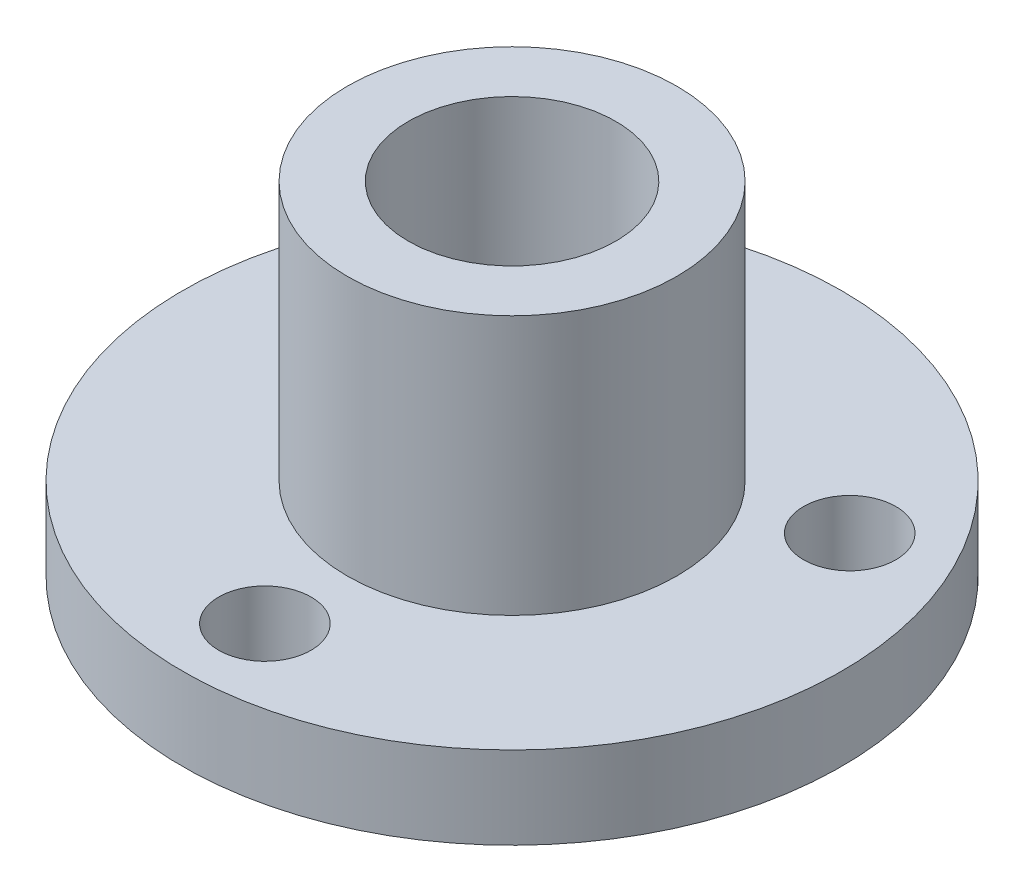
ISO-10303-21;
HEADER;
FILE_DESCRIPTION(('STEP AP214'),'2;1');
FILE_NAME('part.step','',(''),(''),'','','');
FILE_SCHEMA(('AUTOMOTIVE_DESIGN { 1 0 10303 214 1 1 1 1 }'));
ENDSEC;
DATA;
#1=APPLICATION_CONTEXT('core data for automotive mechanical design processes');
#2=APPLICATION_PROTOCOL_DEFINITION('international standard','automotive_design',2000,#1);
#3=PRODUCT_CONTEXT('',#1,'mechanical');
#4=PRODUCT('Part','Part','',(#3));
#5=PRODUCT_RELATED_PRODUCT_CATEGORY('part','',(#4));
#6=PRODUCT_DEFINITION_FORMATION('','',#4);
#7=PRODUCT_DEFINITION_CONTEXT('part definition',#1,'design');
#8=PRODUCT_DEFINITION('design','',#6,#7);
#9=PRODUCT_DEFINITION_SHAPE('','',#8);
#10=(LENGTH_UNIT() NAMED_UNIT(*) SI_UNIT(.MILLI.,.METRE.));
#11=(NAMED_UNIT(*) PLANE_ANGLE_UNIT() SI_UNIT($,.RADIAN.));
#12=(NAMED_UNIT(*) SI_UNIT($,.STERADIAN.) SOLID_ANGLE_UNIT());
#13=UNCERTAINTY_MEASURE_WITH_UNIT(LENGTH_MEASURE(1.E-05),#10,'distance_accuracy_value','');
#14=(GEOMETRIC_REPRESENTATION_CONTEXT(3) GLOBAL_UNCERTAINTY_ASSIGNED_CONTEXT((#13)) GLOBAL_UNIT_ASSIGNED_CONTEXT((#10,
#11,#12)) REPRESENTATION_CONTEXT('',''));
#15=CARTESIAN_POINT('',(0.,0.,0.));
#16=DIRECTION('',(0.,0.,1.));
#17=DIRECTION('',(1.,0.,0.));
#18=AXIS2_PLACEMENT_3D('',#15,#16,#17);
#19=CARTESIAN_POINT('',(0.,3.18,0.));
#20=DIRECTION('',(0.,-1.,0.));
#21=DIRECTION('',(0.,0.,-1.));
#22=AXIS2_PLACEMENT_3D('',#19,#20,#21);
#23=CYLINDRICAL_SURFACE('',#22,12.7);
#24=CARTESIAN_POINT('',(0.,3.18,0.));
#25=DIRECTION('',(0.,1.,0.));
#26=DIRECTION('',(0.,0.,1.));
#27=AXIS2_PLACEMENT_3D('',#24,#25,#26);
#28=CIRCLE('',#27,12.7);
#29=CARTESIAN_POINT('',(0.,3.18,-12.7));
#30=VERTEX_POINT('',#29);
#31=EDGE_CURVE('E10',#30,#30,#28,.T.);
#32=CARTESIAN_POINT('',(0.,0.,0.));
#33=DIRECTION('',(0.,1.,0.));
#34=DIRECTION('',(0.,0.,1.));
#35=AXIS2_PLACEMENT_3D('',#32,#33,#34);
#36=CIRCLE('',#35,12.7);
#37=CARTESIAN_POINT('',(0.,0.,-12.7));
#38=VERTEX_POINT('',#37);
#39=EDGE_CURVE('E34',#38,#38,#36,.T.);
#40=CARTESIAN_POINT('',(0.,3.18,-12.7));
#41=CARTESIAN_POINT('',(0.,3.146875,-12.7));
#42=CARTESIAN_POINT('',(0.,3.11375,-12.7));
#43=CARTESIAN_POINT('',(0.,3.0475,-12.7));
#44=CARTESIAN_POINT('',(0.,3.014375,-12.7));
#45=CARTESIAN_POINT('',(0.,2.948125,-12.7));
#46=CARTESIAN_POINT('',(0.,2.915,-12.7));
#47=CARTESIAN_POINT('',(0.,2.84875,-12.7));
#48=CARTESIAN_POINT('',(0.,2.815625,-12.7));
#49=CARTESIAN_POINT('',(0.,2.749375,-12.7));
#50=CARTESIAN_POINT('',(0.,2.71625,-12.7));
#51=CARTESIAN_POINT('',(0.,2.65,-12.7));
#52=CARTESIAN_POINT('',(0.,2.616875,-12.7));
#53=CARTESIAN_POINT('',(0.,2.550625,-12.7));
#54=CARTESIAN_POINT('',(0.,2.5175,-12.7));
#55=CARTESIAN_POINT('',(0.,2.45125,-12.7));
#56=CARTESIAN_POINT('',(0.,2.418125,-12.7));
#57=CARTESIAN_POINT('',(0.,2.351875,-12.7));
#58=CARTESIAN_POINT('',(0.,2.31875,-12.7));
#59=CARTESIAN_POINT('',(0.,2.2525,-12.7));
#60=CARTESIAN_POINT('',(0.,2.219375,-12.7));
#61=CARTESIAN_POINT('',(0.,2.153125,-12.7));
#62=CARTESIAN_POINT('',(0.,2.12,-12.7));
#63=CARTESIAN_POINT('',(0.,2.05375,-12.7));
#64=CARTESIAN_POINT('',(0.,2.020625,-12.7));
#65=CARTESIAN_POINT('',(0.,1.954375,-12.7));
#66=CARTESIAN_POINT('',(0.,1.92125,-12.7));
#67=CARTESIAN_POINT('',(0.,1.855,-12.7));
#68=CARTESIAN_POINT('',(0.,1.821875,-12.7));
#69=CARTESIAN_POINT('',(0.,1.755625,-12.7));
#70=CARTESIAN_POINT('',(0.,1.7225,-12.7));
#71=CARTESIAN_POINT('',(0.,1.65625,-12.7));
#72=CARTESIAN_POINT('',(0.,1.623125,-12.7));
#73=CARTESIAN_POINT('',(0.,1.556875,-12.7));
#74=CARTESIAN_POINT('',(0.,1.52375,-12.7));
#75=CARTESIAN_POINT('',(0.,1.4575,-12.7));
#76=CARTESIAN_POINT('',(0.,1.424375,-12.7));
#77=CARTESIAN_POINT('',(0.,1.358125,-12.7));
#78=CARTESIAN_POINT('',(0.,1.325,-12.7));
#79=CARTESIAN_POINT('',(0.,1.25875,-12.7));
#80=CARTESIAN_POINT('',(0.,1.225625,-12.7));
#81=CARTESIAN_POINT('',(0.,1.159375,-12.7));
#82=CARTESIAN_POINT('',(0.,1.12625,-12.7));
#83=CARTESIAN_POINT('',(0.,1.06,-12.7));
#84=CARTESIAN_POINT('',(0.,1.026875,-12.7));
#85=CARTESIAN_POINT('',(0.,0.960625,-12.7));
#86=CARTESIAN_POINT('',(0.,0.9275,-12.7));
#87=CARTESIAN_POINT('',(0.,0.86125,-12.7));
#88=CARTESIAN_POINT('',(0.,0.828125,-12.7));
#89=CARTESIAN_POINT('',(0.,0.761875,-12.7));
#90=CARTESIAN_POINT('',(0.,0.72875,-12.7));
#91=CARTESIAN_POINT('',(0.,0.6625,-12.7));
#92=CARTESIAN_POINT('',(0.,0.629375,-12.7));
#93=CARTESIAN_POINT('',(0.,0.563125,-12.7));
#94=CARTESIAN_POINT('',(0.,0.53,-12.7));
#95=CARTESIAN_POINT('',(0.,0.46375,-12.7));
#96=CARTESIAN_POINT('',(0.,0.430625,-12.7));
#97=CARTESIAN_POINT('',(0.,0.364375,-12.7));
#98=CARTESIAN_POINT('',(0.,0.33125,-12.7));
#99=CARTESIAN_POINT('',(0.,0.265,-12.7));
#100=CARTESIAN_POINT('',(0.,0.231875,-12.7));
#101=CARTESIAN_POINT('',(0.,0.165625,-12.7));
#102=CARTESIAN_POINT('',(0.,0.1325,-12.7));
#103=CARTESIAN_POINT('',(0.,0.06625,-12.7));
#104=CARTESIAN_POINT('',(0.,0.033125,-12.7));
#105=CARTESIAN_POINT('',(0.,0.,-12.7));
#106=B_SPLINE_CURVE_WITH_KNOTS('',3,(#40,#41,#42,#43,#44,#45,#46,#47,#48,#49,#50,#51,#52,#53,
#54,#55,#56,#57,#58,#59,#60,#61,#62,#63,#64,#65,#66,#67,#68,#69,#70,#71,#72,#73,#74,#75,#76,#77,
#78,#79,#80,#81,#82,#83,#84,#85,#86,#87,#88,#89,#90,#91,#92,#93,#94,#95,#96,#97,#98,#99,#100,
#101,#102,#103,#104,#105),.UNSPECIFIED.,.F.,.F.,(4,2,2,2,2,2,2,2,2,2,2,2,2,2,2,2,2,2,2,2,2,2,2,
2,2,2,2,2,2,2,2,2,4),(0.,0.0993749999999996,0.19875,0.298125,0.3975,0.496875,0.59625,0.695625,
0.795,0.894375,0.99375,1.093125,1.1925,1.291875,1.39125,1.490625,1.59,1.689375,1.78875,1.888125,
1.9875,2.086875,2.18625,2.285625,2.385,2.484375,2.58375,2.683125,2.7825,2.881875,2.98125,
3.080625,3.18),.UNSPECIFIED.);
#107=EDGE_CURVE('BSEAM31',#30,#38,#106,.T.);
#108=ORIENTED_EDGE('',*,*,#31,.F.);
#109=ORIENTED_EDGE('',*,*,#39,.T.);
#110=ORIENTED_EDGE('',*,*,#107,.T.);
#111=ORIENTED_EDGE('',*,*,#107,.F.);
#112=EDGE_LOOP('',(#108,#110,#109,#111));
#113=FACE_BOUND('',#112,.T.);
#114=ADVANCED_FACE('F31',(#113),#23,.T.);
#115=CARTESIAN_POINT('',(0.,3.18,0.));
#116=DIRECTION('',(0.,1.,0.));
#117=DIRECTION('',(0.,0.,1.));
#118=AXIS2_PLACEMENT_3D('',#115,#116,#117);
#119=PLANE('',#118);
#120=CARTESIAN_POINT('',(8.24889197104678,3.18,-4.7625));
#121=DIRECTION('',(0.,1.,0.));
#122=DIRECTION('',(0.,0.,1.));
#123=AXIS2_PLACEMENT_3D('',#120,#121,#122);
#124=CIRCLE('',#123,1.78);
#125=CARTESIAN_POINT('',(8.24889197104678,3.18,-2.9825));
#126=VERTEX_POINT('',#125);
#127=EDGE_CURVE('E67',#126,#126,#124,.T.);
#128=ORIENTED_EDGE('',*,*,#127,.F.);
#129=EDGE_LOOP('',(#128));
#130=FACE_BOUND('',#129,.T.);
#131=CARTESIAN_POINT('',(-8.24889197104678,3.18,-4.7625));
#132=DIRECTION('',(0.,1.,0.));
#133=DIRECTION('',(0.,0.,1.));
#134=AXIS2_PLACEMENT_3D('',#131,#132,#133);
#135=CIRCLE('',#134,1.78);
#136=CARTESIAN_POINT('',(-8.24889197104678,3.18,-2.9825));
#137=VERTEX_POINT('',#136);
#138=EDGE_CURVE('E61',#137,#137,#135,.T.);
#139=ORIENTED_EDGE('',*,*,#138,.F.);
#140=EDGE_LOOP('',(#139));
#141=FACE_BOUND('',#140,.T.);
#142=CARTESIAN_POINT('',(0.,3.18,9.525));
#143=DIRECTION('',(0.,1.,0.));
#144=DIRECTION('',(0.,0.,1.));
#145=AXIS2_PLACEMENT_3D('',#142,#143,#144);
#146=CIRCLE('',#145,1.78);
#147=CARTESIAN_POINT('',(0.,3.18,11.305));
#148=VERTEX_POINT('',#147);
#149=EDGE_CURVE('E55',#148,#148,#146,.T.);
#150=ORIENTED_EDGE('',*,*,#149,.F.);
#151=EDGE_LOOP('',(#150));
#152=FACE_BOUND('',#151,.T.);
#153=CARTESIAN_POINT('',(0.,3.18,0.));
#154=DIRECTION('',(0.,1.,0.));
#155=DIRECTION('',(0.,0.,1.));
#156=AXIS2_PLACEMENT_3D('',#153,#154,#155);
#157=CIRCLE('',#156,6.35);
#158=CARTESIAN_POINT('',(0.,3.18,6.35));
#159=VERTEX_POINT('',#158);
#160=EDGE_CURVE('E43',#159,#159,#157,.T.);
#161=ORIENTED_EDGE('',*,*,#160,.F.);
#162=EDGE_LOOP('',(#161));
#163=FACE_BOUND('',#162,.T.);
#164=ORIENTED_EDGE('',*,*,#31,.T.);
#165=EDGE_LOOP('',(#164));
#166=FACE_BOUND('',#165,.T.);
#167=ADVANCED_FACE('F83',(#130,#141,#152,#163,#166),#119,.T.);
#168=CARTESIAN_POINT('',(0.,0.,0.));
#169=DIRECTION('',(0.,1.,0.));
#170=DIRECTION('',(0.,0.,1.));
#171=AXIS2_PLACEMENT_3D('',#168,#169,#170);
#172=PLANE('',#171);
#173=CARTESIAN_POINT('',(8.24889197104678,0.,-4.7625));
#174=DIRECTION('',(0.,1.,0.));
#175=DIRECTION('',(0.,0.,1.));
#176=AXIS2_PLACEMENT_3D('',#173,#174,#175);
#177=CIRCLE('',#176,1.78);
#178=CARTESIAN_POINT('',(8.24889197104678,0.,-2.9825));
#179=VERTEX_POINT('',#178);
#180=EDGE_CURVE('E64',#179,#179,#177,.T.);
#181=ORIENTED_EDGE('',*,*,#180,.T.);
#182=EDGE_LOOP('',(#181));
#183=FACE_BOUND('',#182,.T.);
#184=CARTESIAN_POINT('',(-8.24889197104678,0.,-4.7625));
#185=DIRECTION('',(0.,1.,0.));
#186=DIRECTION('',(0.,0.,1.));
#187=AXIS2_PLACEMENT_3D('',#184,#185,#186);
#188=CIRCLE('',#187,1.78);
#189=CARTESIAN_POINT('',(-8.24889197104678,0.,-2.9825));
#190=VERTEX_POINT('',#189);
#191=EDGE_CURVE('E58',#190,#190,#188,.T.);
#192=ORIENTED_EDGE('',*,*,#191,.T.);
#193=EDGE_LOOP('',(#192));
#194=FACE_BOUND('',#193,.T.);
#195=CARTESIAN_POINT('',(0.,0.,9.525));
#196=DIRECTION('',(0.,1.,0.));
#197=DIRECTION('',(0.,0.,1.));
#198=AXIS2_PLACEMENT_3D('',#195,#196,#197);
#199=CIRCLE('',#198,1.78);
#200=CARTESIAN_POINT('',(0.,0.,11.305));
#201=VERTEX_POINT('',#200);
#202=EDGE_CURVE('E52',#201,#201,#199,.T.);
#203=ORIENTED_EDGE('',*,*,#202,.T.);
#204=EDGE_LOOP('',(#203));
#205=FACE_BOUND('',#204,.T.);
#206=CARTESIAN_POINT('',(0.,0.,0.));
#207=DIRECTION('',(0.,1.,0.));
#208=DIRECTION('',(0.,0.,1.));
#209=AXIS2_PLACEMENT_3D('',#206,#207,#208);
#210=CIRCLE('',#209,4.);
#211=CARTESIAN_POINT('',(0.,0.,4.));
#212=VERTEX_POINT('',#211);
#213=EDGE_CURVE('E46',#212,#212,#210,.T.);
#214=ORIENTED_EDGE('',*,*,#213,.T.);
#215=EDGE_LOOP('',(#214));
#216=FACE_BOUND('',#215,.T.);
#217=ORIENTED_EDGE('',*,*,#39,.F.);
#218=EDGE_LOOP('',(#217));
#219=FACE_BOUND('',#218,.T.);
#220=ADVANCED_FACE('F73',(#183,#194,#205,#216,#219),#172,.F.);
#221=CARTESIAN_POINT('',(0.,13.18,0.));
#222=DIRECTION('',(0.,-1.,0.));
#223=DIRECTION('',(0.,0.,-1.));
#224=AXIS2_PLACEMENT_3D('',#221,#222,#223);
#225=CYLINDRICAL_SURFACE('',#224,6.35);
#226=CARTESIAN_POINT('',(0.,13.18,0.));
#227=DIRECTION('',(0.,1.,0.));
#228=DIRECTION('',(0.,0.,1.));
#229=AXIS2_PLACEMENT_3D('',#226,#227,#228);
#230=CIRCLE('',#229,6.35);
#231=CARTESIAN_POINT('',(0.,13.18,6.35));
#232=VERTEX_POINT('',#231);
#233=EDGE_CURVE('E41',#232,#232,#230,.T.);
#234=ORIENTED_EDGE('',*,*,#233,.F.);
#235=EDGE_LOOP('',(#234));
#236=FACE_BOUND('',#235,.T.);
#237=ORIENTED_EDGE('',*,*,#160,.T.);
#238=EDGE_LOOP('',(#237));
#239=FACE_BOUND('',#238,.T.);
#240=ADVANCED_FACE('F93',(#236,#239),#225,.T.);
#241=CARTESIAN_POINT('',(0.,13.18,0.));
#242=DIRECTION('',(0.,1.,0.));
#243=DIRECTION('',(0.,0.,1.));
#244=AXIS2_PLACEMENT_3D('',#241,#242,#243);
#245=PLANE('',#244);
#246=CARTESIAN_POINT('',(0.,13.18,0.));
#247=DIRECTION('',(0.,1.,0.));
#248=DIRECTION('',(0.,0.,1.));
#249=AXIS2_PLACEMENT_3D('',#246,#247,#248);
#250=CIRCLE('',#249,4.);
#251=CARTESIAN_POINT('',(0.,13.18,4.));
#252=VERTEX_POINT('',#251);
#253=EDGE_CURVE('E49',#252,#252,#250,.T.);
#254=ORIENTED_EDGE('',*,*,#253,.F.);
#255=EDGE_LOOP('',(#254));
#256=FACE_BOUND('',#255,.T.);
#257=ORIENTED_EDGE('',*,*,#233,.T.);
#258=EDGE_LOOP('',(#257));
#259=FACE_BOUND('',#258,.T.);
#260=ADVANCED_FACE('F95',(#256,#259),#245,.T.);
#261=CARTESIAN_POINT('',(0.,0.,0.));
#262=DIRECTION('',(0.,1.,0.));
#263=DIRECTION('',(0.,0.,1.));
#264=AXIS2_PLACEMENT_3D('',#261,#262,#263);
#265=CYLINDRICAL_SURFACE('',#264,4.);
#266=ORIENTED_EDGE('',*,*,#213,.F.);
#267=EDGE_LOOP('',(#266));
#268=FACE_BOUND('',#267,.T.);
#269=ORIENTED_EDGE('',*,*,#253,.T.);
#270=EDGE_LOOP('',(#269));
#271=FACE_BOUND('',#270,.T.);
#272=ADVANCED_FACE('F102',(#268,#271),#265,.F.);
#273=CARTESIAN_POINT('',(0.,0.,9.525));
#274=DIRECTION('',(0.,1.,0.));
#275=DIRECTION('',(0.,0.,1.));
#276=AXIS2_PLACEMENT_3D('',#273,#274,#275);
#277=CYLINDRICAL_SURFACE('',#276,1.78);
#278=CARTESIAN_POINT('',(0.,0.,11.305));
#279=CARTESIAN_POINT('',(0.,0.033125,11.305));
#280=CARTESIAN_POINT('',(0.,0.06625,11.305));
#281=CARTESIAN_POINT('',(0.,0.1325,11.305));
#282=CARTESIAN_POINT('',(0.,0.165625,11.305));
#283=CARTESIAN_POINT('',(0.,0.231875,11.305));
#284=CARTESIAN_POINT('',(0.,0.265,11.305));
#285=CARTESIAN_POINT('',(0.,0.33125,11.305));
#286=CARTESIAN_POINT('',(0.,0.364375,11.305));
#287=CARTESIAN_POINT('',(0.,0.430625,11.305));
#288=CARTESIAN_POINT('',(0.,0.46375,11.305));
#289=CARTESIAN_POINT('',(0.,0.53,11.305));
#290=CARTESIAN_POINT('',(0.,0.563125,11.305));
#291=CARTESIAN_POINT('',(0.,0.629375,11.305));
#292=CARTESIAN_POINT('',(0.,0.6625,11.305));
#293=CARTESIAN_POINT('',(0.,0.72875,11.305));
#294=CARTESIAN_POINT('',(0.,0.761875,11.305));
#295=CARTESIAN_POINT('',(0.,0.828125,11.305));
#296=CARTESIAN_POINT('',(0.,0.86125,11.305));
#297=CARTESIAN_POINT('',(0.,0.9275,11.305));
#298=CARTESIAN_POINT('',(0.,0.960625,11.305));
#299=CARTESIAN_POINT('',(0.,1.026875,11.305));
#300=CARTESIAN_POINT('',(0.,1.06,11.305));
#301=CARTESIAN_POINT('',(0.,1.12625,11.305));
#302=CARTESIAN_POINT('',(0.,1.159375,11.305));
#303=CARTESIAN_POINT('',(0.,1.225625,11.305));
#304=CARTESIAN_POINT('',(0.,1.25875,11.305));
#305=CARTESIAN_POINT('',(0.,1.325,11.305));
#306=CARTESIAN_POINT('',(0.,1.358125,11.305));
#307=CARTESIAN_POINT('',(0.,1.424375,11.305));
#308=CARTESIAN_POINT('',(0.,1.4575,11.305));
#309=CARTESIAN_POINT('',(0.,1.52375,11.305));
#310=CARTESIAN_POINT('',(0.,1.556875,11.305));
#311=CARTESIAN_POINT('',(0.,1.623125,11.305));
#312=CARTESIAN_POINT('',(0.,1.65625,11.305));
#313=CARTESIAN_POINT('',(0.,1.7225,11.305));
#314=CARTESIAN_POINT('',(0.,1.755625,11.305));
#315=CARTESIAN_POINT('',(0.,1.821875,11.305));
#316=CARTESIAN_POINT('',(0.,1.855,11.305));
#317=CARTESIAN_POINT('',(0.,1.92125,11.305));
#318=CARTESIAN_POINT('',(0.,1.954375,11.305));
#319=CARTESIAN_POINT('',(0.,2.020625,11.305));
#320=CARTESIAN_POINT('',(0.,2.05375,11.305));
#321=CARTESIAN_POINT('',(0.,2.12,11.305));
#322=CARTESIAN_POINT('',(0.,2.153125,11.305));
#323=CARTESIAN_POINT('',(0.,2.219375,11.305));
#324=CARTESIAN_POINT('',(0.,2.2525,11.305));
#325=CARTESIAN_POINT('',(0.,2.31875,11.305));
#326=CARTESIAN_POINT('',(0.,2.351875,11.305));
#327=CARTESIAN_POINT('',(0.,2.418125,11.305));
#328=CARTESIAN_POINT('',(0.,2.45125,11.305));
#329=CARTESIAN_POINT('',(0.,2.5175,11.305));
#330=CARTESIAN_POINT('',(0.,2.550625,11.305));
#331=CARTESIAN_POINT('',(0.,2.616875,11.305));
#332=CARTESIAN_POINT('',(0.,2.65,11.305));
#333=CARTESIAN_POINT('',(0.,2.71625,11.305));
#334=CARTESIAN_POINT('',(0.,2.749375,11.305));
#335=CARTESIAN_POINT('',(0.,2.815625,11.305));
#336=CARTESIAN_POINT('',(0.,2.84875,11.305));
#337=CARTESIAN_POINT('',(0.,2.915,11.305));
#338=CARTESIAN_POINT('',(0.,2.948125,11.305));
#339=CARTESIAN_POINT('',(0.,3.014375,11.305));
#340=CARTESIAN_POINT('',(0.,3.0475,11.305));
#341=CARTESIAN_POINT('',(0.,3.11375,11.305));
#342=CARTESIAN_POINT('',(0.,3.146875,11.305));
#343=CARTESIAN_POINT('',(0.,3.18,11.305));
#344=B_SPLINE_CURVE_WITH_KNOTS('',3,(#278,#279,#280,#281,#282,#283,#284,#285,#286,#287,#288,
#289,#290,#291,#292,#293,#294,#295,#296,#297,#298,#299,#300,#301,#302,#303,#304,#305,#306,#307,
#308,#309,#310,#311,#312,#313,#314,#315,#316,#317,#318,#319,#320,#321,#322,#323,#324,#325,#326,
#327,#328,#329,#330,#331,#332,#333,#334,#335,#336,#337,#338,#339,#340,#341,#342,#343),
.UNSPECIFIED.,.F.,.F.,(4,2,2,2,2,2,2,2,2,2,2,2,2,2,2,2,2,2,2,2,2,2,2,2,2,2,2,2,2,2,2,2,4),(0.,
0.099375,0.19875,0.298125,0.3975,0.496875,0.59625,0.695625,0.795,0.894375,0.99375,1.093125,
1.1925,1.291875,1.39125,1.490625,1.59,1.689375,1.78875,1.888125,1.9875,2.086875,2.18625,
2.285625,2.385,2.484375,2.58375,2.683125,2.7825,2.881875,2.98125,3.080625,3.18),.UNSPECIFIED.);
#345=EDGE_CURVE('BSEAM128',#201,#148,#344,.T.);
#346=ORIENTED_EDGE('',*,*,#202,.F.);
#347=ORIENTED_EDGE('',*,*,#149,.T.);
#348=ORIENTED_EDGE('',*,*,#345,.T.);
#349=ORIENTED_EDGE('',*,*,#345,.F.);
#350=EDGE_LOOP('',(#346,#348,#347,#349));
#351=FACE_BOUND('',#350,.T.);
#352=ADVANCED_FACE('F128',(#351),#277,.F.);
#353=CARTESIAN_POINT('',(-8.24889197104678,0.,-4.7625));
#354=DIRECTION('',(0.,1.,0.));
#355=DIRECTION('',(0.,0.,1.));
#356=AXIS2_PLACEMENT_3D('',#353,#354,#355);
#357=CYLINDRICAL_SURFACE('',#356,1.78);
#358=CARTESIAN_POINT('',(-8.24889197104678,0.,-2.9825));
#359=CARTESIAN_POINT('',(-8.24889197104678,0.033125,-2.9825));
#360=CARTESIAN_POINT('',(-8.24889197104678,0.06625,-2.9825));
#361=CARTESIAN_POINT('',(-8.24889197104678,0.1325,-2.9825));
#362=CARTESIAN_POINT('',(-8.24889197104678,0.165625,-2.9825));
#363=CARTESIAN_POINT('',(-8.24889197104678,0.231875,-2.9825));
#364=CARTESIAN_POINT('',(-8.24889197104678,0.265,-2.9825));
#365=CARTESIAN_POINT('',(-8.24889197104678,0.33125,-2.9825));
#366=CARTESIAN_POINT('',(-8.24889197104678,0.364375,-2.9825));
#367=CARTESIAN_POINT('',(-8.24889197104678,0.430625,-2.9825));
#368=CARTESIAN_POINT('',(-8.24889197104678,0.46375,-2.9825));
#369=CARTESIAN_POINT('',(-8.24889197104678,0.53,-2.9825));
#370=CARTESIAN_POINT('',(-8.24889197104678,0.563125,-2.9825));
#371=CARTESIAN_POINT('',(-8.24889197104678,0.629375,-2.9825));
#372=CARTESIAN_POINT('',(-8.24889197104678,0.6625,-2.9825));
#373=CARTESIAN_POINT('',(-8.24889197104678,0.72875,-2.9825));
#374=CARTESIAN_POINT('',(-8.24889197104678,0.761875,-2.9825));
#375=CARTESIAN_POINT('',(-8.24889197104678,0.828125,-2.9825));
#376=CARTESIAN_POINT('',(-8.24889197104678,0.86125,-2.9825));
#377=CARTESIAN_POINT('',(-8.24889197104678,0.9275,-2.9825));
#378=CARTESIAN_POINT('',(-8.24889197104678,0.960625,-2.9825));
#379=CARTESIAN_POINT('',(-8.24889197104678,1.026875,-2.9825));
#380=CARTESIAN_POINT('',(-8.24889197104678,1.06,-2.9825));
#381=CARTESIAN_POINT('',(-8.24889197104678,1.12625,-2.9825));
#382=CARTESIAN_POINT('',(-8.24889197104678,1.159375,-2.9825));
#383=CARTESIAN_POINT('',(-8.24889197104678,1.225625,-2.9825));
#384=CARTESIAN_POINT('',(-8.24889197104678,1.25875,-2.9825));
#385=CARTESIAN_POINT('',(-8.24889197104678,1.325,-2.9825));
#386=CARTESIAN_POINT('',(-8.24889197104678,1.358125,-2.9825));
#387=CARTESIAN_POINT('',(-8.24889197104678,1.424375,-2.9825));
#388=CARTESIAN_POINT('',(-8.24889197104678,1.4575,-2.9825));
#389=CARTESIAN_POINT('',(-8.24889197104678,1.52375,-2.9825));
#390=CARTESIAN_POINT('',(-8.24889197104678,1.556875,-2.9825));
#391=CARTESIAN_POINT('',(-8.24889197104678,1.623125,-2.9825));
#392=CARTESIAN_POINT('',(-8.24889197104678,1.65625,-2.9825));
#393=CARTESIAN_POINT('',(-8.24889197104678,1.7225,-2.9825));
#394=CARTESIAN_POINT('',(-8.24889197104678,1.755625,-2.9825));
#395=CARTESIAN_POINT('',(-8.24889197104678,1.821875,-2.9825));
#396=CARTESIAN_POINT('',(-8.24889197104678,1.855,-2.9825));
#397=CARTESIAN_POINT('',(-8.24889197104678,1.92125,-2.9825));
#398=CARTESIAN_POINT('',(-8.24889197104678,1.954375,-2.9825));
#399=CARTESIAN_POINT('',(-8.24889197104678,2.020625,-2.9825));
#400=CARTESIAN_POINT('',(-8.24889197104678,2.05375,-2.9825));
#401=CARTESIAN_POINT('',(-8.24889197104678,2.12,-2.9825));
#402=CARTESIAN_POINT('',(-8.24889197104678,2.153125,-2.9825));
#403=CARTESIAN_POINT('',(-8.24889197104678,2.219375,-2.9825));
#404=CARTESIAN_POINT('',(-8.24889197104678,2.2525,-2.9825));
#405=CARTESIAN_POINT('',(-8.24889197104678,2.31875,-2.9825));
#406=CARTESIAN_POINT('',(-8.24889197104678,2.351875,-2.9825));
#407=CARTESIAN_POINT('',(-8.24889197104678,2.418125,-2.9825));
#408=CARTESIAN_POINT('',(-8.24889197104678,2.45125,-2.9825));
#409=CARTESIAN_POINT('',(-8.24889197104678,2.5175,-2.9825));
#410=CARTESIAN_POINT('',(-8.24889197104678,2.550625,-2.9825));
#411=CARTESIAN_POINT('',(-8.24889197104678,2.616875,-2.9825));
#412=CARTESIAN_POINT('',(-8.24889197104678,2.65,-2.9825));
#413=CARTESIAN_POINT('',(-8.24889197104678,2.71625,-2.9825));
#414=CARTESIAN_POINT('',(-8.24889197104678,2.749375,-2.9825));
#415=CARTESIAN_POINT('',(-8.24889197104678,2.815625,-2.9825));
#416=CARTESIAN_POINT('',(-8.24889197104678,2.84875,-2.9825));
#417=CARTESIAN_POINT('',(-8.24889197104678,2.915,-2.9825));
#418=CARTESIAN_POINT('',(-8.24889197104678,2.948125,-2.9825));
#419=CARTESIAN_POINT('',(-8.24889197104678,3.014375,-2.9825));
#420=CARTESIAN_POINT('',(-8.24889197104678,3.0475,-2.9825));
#421=CARTESIAN_POINT('',(-8.24889197104678,3.11375,-2.9825));
#422=CARTESIAN_POINT('',(-8.24889197104678,3.146875,-2.9825));
#423=CARTESIAN_POINT('',(-8.24889197104678,3.18,-2.9825));
#424=B_SPLINE_CURVE_WITH_KNOTS('',3,(#358,#359,#360,#361,#362,#363,#364,#365,#366,#367,#368,
#369,#370,#371,#372,#373,#374,#375,#376,#377,#378,#379,#380,#381,#382,#383,#384,#385,#386,#387,
#388,#389,#390,#391,#392,#393,#394,#395,#396,#397,#398,#399,#400,#401,#402,#403,#404,#405,#406,
#407,#408,#409,#410,#411,#412,#413,#414,#415,#416,#417,#418,#419,#420,#421,#422,#423),
.UNSPECIFIED.,.F.,.F.,(4,2,2,2,2,2,2,2,2,2,2,2,2,2,2,2,2,2,2,2,2,2,2,2,2,2,2,2,2,2,2,2,4),(0.,
0.099375,0.19875,0.298125,0.3975,0.496875,0.59625,0.695625,0.795,0.894375,0.99375,1.093125,
1.1925,1.291875,1.39125,1.490625,1.59,1.689375,1.78875,1.888125,1.9875,2.086875,2.18625,
2.285625,2.385,2.484375,2.58375,2.683125,2.7825,2.881875,2.98125,3.080625,3.18),.UNSPECIFIED.);
#425=EDGE_CURVE('BSEAM79',#190,#137,#424,.T.);
#426=ORIENTED_EDGE('',*,*,#191,.F.);
#427=ORIENTED_EDGE('',*,*,#138,.T.);
#428=ORIENTED_EDGE('',*,*,#425,.T.);
#429=ORIENTED_EDGE('',*,*,#425,.F.);
#430=EDGE_LOOP('',(#426,#428,#427,#429));
#431=FACE_BOUND('',#430,.T.);
#432=ADVANCED_FACE('F79',(#431),#357,.F.);
#433=CARTESIAN_POINT('',(8.24889197104678,0.,-4.7625));
#434=DIRECTION('',(0.,1.,0.));
#435=DIRECTION('',(0.,0.,1.));
#436=AXIS2_PLACEMENT_3D('',#433,#434,#435);
#437=CYLINDRICAL_SURFACE('',#436,1.78);
#438=CARTESIAN_POINT('',(8.24889197104678,0.,-2.9825));
#439=CARTESIAN_POINT('',(8.24889197104678,0.033125,-2.9825));
#440=CARTESIAN_POINT('',(8.24889197104678,0.06625,-2.9825));
#441=CARTESIAN_POINT('',(8.24889197104678,0.1325,-2.9825));
#442=CARTESIAN_POINT('',(8.24889197104678,0.165625,-2.9825));
#443=CARTESIAN_POINT('',(8.24889197104678,0.231875,-2.9825));
#444=CARTESIAN_POINT('',(8.24889197104678,0.265,-2.9825));
#445=CARTESIAN_POINT('',(8.24889197104678,0.33125,-2.9825));
#446=CARTESIAN_POINT('',(8.24889197104678,0.364375,-2.9825));
#447=CARTESIAN_POINT('',(8.24889197104678,0.430625,-2.9825));
#448=CARTESIAN_POINT('',(8.24889197104678,0.46375,-2.9825));
#449=CARTESIAN_POINT('',(8.24889197104678,0.53,-2.9825));
#450=CARTESIAN_POINT('',(8.24889197104678,0.563125,-2.9825));
#451=CARTESIAN_POINT('',(8.24889197104678,0.629375,-2.9825));
#452=CARTESIAN_POINT('',(8.24889197104678,0.6625,-2.9825));
#453=CARTESIAN_POINT('',(8.24889197104678,0.72875,-2.9825));
#454=CARTESIAN_POINT('',(8.24889197104678,0.761875,-2.9825));
#455=CARTESIAN_POINT('',(8.24889197104678,0.828125,-2.9825));
#456=CARTESIAN_POINT('',(8.24889197104678,0.86125,-2.9825));
#457=CARTESIAN_POINT('',(8.24889197104678,0.9275,-2.9825));
#458=CARTESIAN_POINT('',(8.24889197104678,0.960625,-2.9825));
#459=CARTESIAN_POINT('',(8.24889197104678,1.026875,-2.9825));
#460=CARTESIAN_POINT('',(8.24889197104678,1.06,-2.9825));
#461=CARTESIAN_POINT('',(8.24889197104678,1.12625,-2.9825));
#462=CARTESIAN_POINT('',(8.24889197104678,1.159375,-2.9825));
#463=CARTESIAN_POINT('',(8.24889197104678,1.225625,-2.9825));
#464=CARTESIAN_POINT('',(8.24889197104678,1.25875,-2.9825));
#465=CARTESIAN_POINT('',(8.24889197104678,1.325,-2.9825));
#466=CARTESIAN_POINT('',(8.24889197104678,1.358125,-2.9825));
#467=CARTESIAN_POINT('',(8.24889197104678,1.424375,-2.9825));
#468=CARTESIAN_POINT('',(8.24889197104678,1.4575,-2.9825));
#469=CARTESIAN_POINT('',(8.24889197104678,1.52375,-2.9825));
#470=CARTESIAN_POINT('',(8.24889197104678,1.556875,-2.9825));
#471=CARTESIAN_POINT('',(8.24889197104678,1.623125,-2.9825));
#472=CARTESIAN_POINT('',(8.24889197104678,1.65625,-2.9825));
#473=CARTESIAN_POINT('',(8.24889197104678,1.7225,-2.9825));
#474=CARTESIAN_POINT('',(8.24889197104678,1.755625,-2.9825));
#475=CARTESIAN_POINT('',(8.24889197104678,1.821875,-2.9825));
#476=CARTESIAN_POINT('',(8.24889197104678,1.855,-2.9825));
#477=CARTESIAN_POINT('',(8.24889197104678,1.92125,-2.9825));
#478=CARTESIAN_POINT('',(8.24889197104678,1.954375,-2.9825));
#479=CARTESIAN_POINT('',(8.24889197104678,2.020625,-2.9825));
#480=CARTESIAN_POINT('',(8.24889197104678,2.05375,-2.9825));
#481=CARTESIAN_POINT('',(8.24889197104678,2.12,-2.9825));
#482=CARTESIAN_POINT('',(8.24889197104678,2.153125,-2.9825));
#483=CARTESIAN_POINT('',(8.24889197104678,2.219375,-2.9825));
#484=CARTESIAN_POINT('',(8.24889197104678,2.2525,-2.9825));
#485=CARTESIAN_POINT('',(8.24889197104678,2.31875,-2.9825));
#486=CARTESIAN_POINT('',(8.24889197104678,2.351875,-2.9825));
#487=CARTESIAN_POINT('',(8.24889197104678,2.418125,-2.9825));
#488=CARTESIAN_POINT('',(8.24889197104678,2.45125,-2.9825));
#489=CARTESIAN_POINT('',(8.24889197104678,2.5175,-2.9825));
#490=CARTESIAN_POINT('',(8.24889197104678,2.550625,-2.9825));
#491=CARTESIAN_POINT('',(8.24889197104678,2.616875,-2.9825));
#492=CARTESIAN_POINT('',(8.24889197104678,2.65,-2.9825));
#493=CARTESIAN_POINT('',(8.24889197104678,2.71625,-2.9825));
#494=CARTESIAN_POINT('',(8.24889197104678,2.749375,-2.9825));
#495=CARTESIAN_POINT('',(8.24889197104678,2.815625,-2.9825));
#496=CARTESIAN_POINT('',(8.24889197104678,2.84875,-2.9825));
#497=CARTESIAN_POINT('',(8.24889197104678,2.915,-2.9825));
#498=CARTESIAN_POINT('',(8.24889197104678,2.948125,-2.9825));
#499=CARTESIAN_POINT('',(8.24889197104678,3.014375,-2.9825));
#500=CARTESIAN_POINT('',(8.24889197104678,3.0475,-2.9825));
#501=CARTESIAN_POINT('',(8.24889197104678,3.11375,-2.9825));
#502=CARTESIAN_POINT('',(8.24889197104678,3.146875,-2.9825));
#503=CARTESIAN_POINT('',(8.24889197104678,3.18,-2.9825));
#504=B_SPLINE_CURVE_WITH_KNOTS('',3,(#438,#439,#440,#441,#442,#443,#444,#445,#446,#447,#448,
#449,#450,#451,#452,#453,#454,#455,#456,#457,#458,#459,#460,#461,#462,#463,#464,#465,#466,#467,
#468,#469,#470,#471,#472,#473,#474,#475,#476,#477,#478,#479,#480,#481,#482,#483,#484,#485,#486,
#487,#488,#489,#490,#491,#492,#493,#494,#495,#496,#497,#498,#499,#500,#501,#502,#503),
.UNSPECIFIED.,.F.,.F.,(4,2,2,2,2,2,2,2,2,2,2,2,2,2,2,2,2,2,2,2,2,2,2,2,2,2,2,2,2,2,2,2,4),(0.,
0.099375,0.19875,0.298125,0.3975,0.496875,0.59625,0.695625,0.795,0.894375,0.99375,1.093125,
1.1925,1.291875,1.39125,1.490625,1.59,1.689375,1.78875,1.888125,1.9875,2.086875,2.18625,
2.285625,2.385,2.484375,2.58375,2.683125,2.7825,2.881875,2.98125,3.080625,3.18),.UNSPECIFIED.);
#505=EDGE_CURVE('BSEAM76',#179,#126,#504,.T.);
#506=ORIENTED_EDGE('',*,*,#180,.F.);
#507=ORIENTED_EDGE('',*,*,#127,.T.);
#508=ORIENTED_EDGE('',*,*,#505,.T.);
#509=ORIENTED_EDGE('',*,*,#505,.F.);
#510=EDGE_LOOP('',(#506,#508,#507,#509));
#511=FACE_BOUND('',#510,.T.);
#512=ADVANCED_FACE('F76',(#511),#437,.F.);
#513=CLOSED_SHELL('',(#114,#167,#220,#240,#260,#272,#352,#432,#512));
#514=MANIFOLD_SOLID_BREP('B2',#513);
#515=ADVANCED_BREP_SHAPE_REPRESENTATION('',(#18,#514),#14);
#516=SHAPE_DEFINITION_REPRESENTATION(#9,#515);
ENDSEC;
END-ISO-10303-21;
